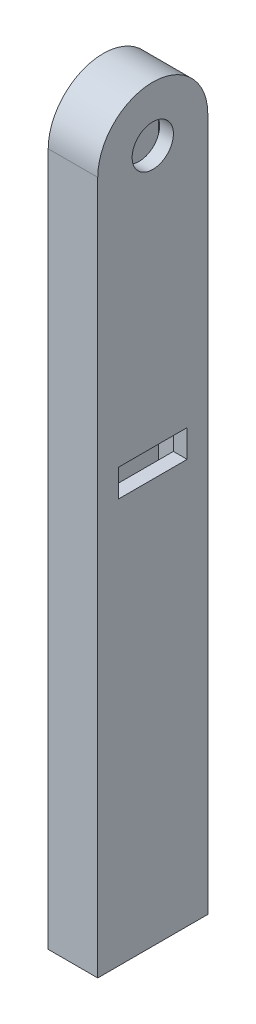
ISO-10303-21;
HEADER;
FILE_DESCRIPTION(('STEP AP214'),'2;1');
FILE_NAME('part.step','',(''),(''),'','','');
FILE_SCHEMA(('AUTOMOTIVE_DESIGN { 1 0 10303 214 1 1 1 1 }'));
ENDSEC;
DATA;
#1=APPLICATION_CONTEXT('core data for automotive mechanical design processes');
#2=APPLICATION_PROTOCOL_DEFINITION('international standard','automotive_design',2000,#1);
#3=PRODUCT_CONTEXT('',#1,'mechanical');
#4=PRODUCT('Part','Part','',(#3));
#5=PRODUCT_RELATED_PRODUCT_CATEGORY('part','',(#4));
#6=PRODUCT_DEFINITION_FORMATION('','',#4);
#7=PRODUCT_DEFINITION_CONTEXT('part definition',#1,'design');
#8=PRODUCT_DEFINITION('design','',#6,#7);
#9=PRODUCT_DEFINITION_SHAPE('','',#8);
#10=(LENGTH_UNIT() NAMED_UNIT(*) SI_UNIT(.MILLI.,.METRE.));
#11=(NAMED_UNIT(*) PLANE_ANGLE_UNIT() SI_UNIT($,.RADIAN.));
#12=(NAMED_UNIT(*) SI_UNIT($,.STERADIAN.) SOLID_ANGLE_UNIT());
#13=UNCERTAINTY_MEASURE_WITH_UNIT(LENGTH_MEASURE(1.E-05),#10,'distance_accuracy_value','');
#14=(GEOMETRIC_REPRESENTATION_CONTEXT(3) GLOBAL_UNCERTAINTY_ASSIGNED_CONTEXT((#13)) GLOBAL_UNIT_ASSIGNED_CONTEXT((#10,
#11,#12)) REPRESENTATION_CONTEXT('',''));
#15=CARTESIAN_POINT('',(0.,0.,0.));
#16=DIRECTION('',(0.,0.,1.));
#17=DIRECTION('',(1.,0.,0.));
#18=AXIS2_PLACEMENT_3D('',#15,#16,#17);
#19=CARTESIAN_POINT('',(-4.,0.,-20.));
#20=DIRECTION('',(0.,0.,-1.));
#21=DIRECTION('',(0.,1.,0.));
#22=AXIS2_PLACEMENT_3D('',#19,#20,#21);
#23=PLANE('',#22);
#24=DIRECTION('',(0.,-1.,0.));
#25=VECTOR('',#24,1.);
#26=CARTESIAN_POINT('',(-9.,0.,-20.));
#27=LINE('',#26,#25);
#28=CARTESIAN_POINT('',(-9.,0.,-20.));
#29=VERTEX_POINT('',#28);
#30=CARTESIAN_POINT('',(-9.,-252.,-20.));
#31=VERTEX_POINT('',#30);
#32=EDGE_CURVE('E196',#29,#31,#27,.T.);
#33=ORIENTED_EDGE('',*,*,#32,.F.);
#34=DIRECTION('',(-1.,0.,0.));
#35=VECTOR('',#34,1.);
#36=CARTESIAN_POINT('',(-4.,0.,-20.));
#37=LINE('',#36,#35);
#38=CARTESIAN_POINT('',(9.,0.,-20.));
#39=VERTEX_POINT('',#38);
#40=EDGE_CURVE('E11',#39,#29,#37,.T.);
#41=ORIENTED_EDGE('',*,*,#40,.F.);
#42=DIRECTION('',(0.,-1.,0.));
#43=VECTOR('',#42,1.);
#44=CARTESIAN_POINT('',(9.,0.,-20.));
#45=LINE('',#44,#43);
#46=CARTESIAN_POINT('',(9.,-252.,-20.));
#47=VERTEX_POINT('',#46);
#48=EDGE_CURVE('E168',#39,#47,#45,.T.);
#49=ORIENTED_EDGE('',*,*,#48,.T.);
#50=DIRECTION('',(-1.,0.,0.));
#51=VECTOR('',#50,1.);
#52=CARTESIAN_POINT('',(-4.,-252.,-20.));
#53=LINE('',#52,#51);
#54=EDGE_CURVE('E215',#47,#31,#53,.T.);
#55=ORIENTED_EDGE('',*,*,#54,.T.);
#56=EDGE_LOOP('',(#33,#41,#49,#55));
#57=FACE_BOUND('',#56,.T.);
#58=ADVANCED_FACE('F35',(#57),#23,.T.);
#59=CARTESIAN_POINT('',(-4.,0.,0.));
#60=DIRECTION('',(-1.,0.,0.));
#61=DIRECTION('',(0.,0.,1.));
#62=AXIS2_PLACEMENT_3D('',#59,#60,#61);
#63=CYLINDRICAL_SURFACE('',#62,20.);
#64=CARTESIAN_POINT('',(-9.,0.,0.));
#65=DIRECTION('',(1.,0.,0.));
#66=DIRECTION('',(0.,0.,-1.));
#67=AXIS2_PLACEMENT_3D('',#64,#65,#66);
#68=CIRCLE('',#67,20.);
#69=CARTESIAN_POINT('',(-9.,0.,20.));
#70=VERTEX_POINT('',#69);
#71=EDGE_CURVE('E219',#29,#70,#68,.T.);
#72=ORIENTED_EDGE('',*,*,#71,.T.);
#73=DIRECTION('',(-1.,0.,0.));
#74=VECTOR('',#73,1.);
#75=CARTESIAN_POINT('',(-4.,0.,20.));
#76=LINE('',#75,#74);
#77=CARTESIAN_POINT('',(9.,0.,20.));
#78=VERTEX_POINT('',#77);
#79=EDGE_CURVE('E42',#78,#70,#76,.T.);
#80=ORIENTED_EDGE('',*,*,#79,.F.);
#81=CARTESIAN_POINT('',(9.,0.,0.));
#82=DIRECTION('',(1.,0.,0.));
#83=DIRECTION('',(0.,0.,-1.));
#84=AXIS2_PLACEMENT_3D('',#81,#82,#83);
#85=CIRCLE('',#84,20.);
#86=EDGE_CURVE('E180',#39,#78,#85,.T.);
#87=ORIENTED_EDGE('',*,*,#86,.F.);
#88=ORIENTED_EDGE('',*,*,#40,.T.);
#89=EDGE_LOOP('',(#72,#80,#87,#88));
#90=FACE_BOUND('',#89,.T.);
#91=ADVANCED_FACE('F251',(#90),#63,.T.);
#92=CARTESIAN_POINT('',(-4.,0.,20.));
#93=DIRECTION('',(0.,0.,-1.));
#94=DIRECTION('',(0.,1.,0.));
#95=AXIS2_PLACEMENT_3D('',#92,#93,#94);
#96=PLANE('',#95);
#97=DIRECTION('',(0.,-1.,0.));
#98=VECTOR('',#97,1.);
#99=CARTESIAN_POINT('',(-9.,0.,20.));
#100=LINE('',#99,#98);
#101=CARTESIAN_POINT('',(-9.,-252.,20.));
#102=VERTEX_POINT('',#101);
#103=EDGE_CURVE('E221',#70,#102,#100,.T.);
#104=ORIENTED_EDGE('',*,*,#103,.T.);
#105=DIRECTION('',(-1.,0.,0.));
#106=VECTOR('',#105,1.);
#107=CARTESIAN_POINT('',(-4.,-252.,20.));
#108=LINE('',#107,#106);
#109=CARTESIAN_POINT('',(9.,-252.,20.));
#110=VERTEX_POINT('',#109);
#111=EDGE_CURVE('E229',#110,#102,#108,.T.);
#112=ORIENTED_EDGE('',*,*,#111,.F.);
#113=DIRECTION('',(0.,-1.,0.));
#114=VECTOR('',#113,1.);
#115=CARTESIAN_POINT('',(9.,0.,20.));
#116=LINE('',#115,#114);
#117=EDGE_CURVE('E183',#78,#110,#116,.T.);
#118=ORIENTED_EDGE('',*,*,#117,.F.);
#119=ORIENTED_EDGE('',*,*,#79,.T.);
#120=EDGE_LOOP('',(#104,#112,#118,#119));
#121=FACE_BOUND('',#120,.T.);
#122=ADVANCED_FACE('F235',(#121),#96,.F.);
#123=CARTESIAN_POINT('',(-4.,-252.,0.));
#124=DIRECTION('',(0.,1.,0.));
#125=DIRECTION('',(0.,0.,1.));
#126=AXIS2_PLACEMENT_3D('',#123,#124,#125);
#127=PLANE('',#126);
#128=DIRECTION('',(0.,0.,-1.));
#129=VECTOR('',#128,1.);
#130=CARTESIAN_POINT('',(-9.,-252.,0.));
#131=LINE('',#130,#129);
#132=EDGE_CURVE('E223',#102,#31,#131,.T.);
#133=ORIENTED_EDGE('',*,*,#132,.T.);
#134=ORIENTED_EDGE('',*,*,#54,.F.);
#135=DIRECTION('',(0.,0.,-1.));
#136=VECTOR('',#135,1.);
#137=CARTESIAN_POINT('',(9.,-252.,0.));
#138=LINE('',#137,#136);
#139=EDGE_CURVE('E186',#110,#47,#138,.T.);
#140=ORIENTED_EDGE('',*,*,#139,.F.);
#141=ORIENTED_EDGE('',*,*,#111,.T.);
#142=EDGE_LOOP('',(#133,#134,#140,#141));
#143=FACE_BOUND('',#142,.T.);
#144=ADVANCED_FACE('F245',(#143),#127,.F.);
#145=CARTESIAN_POINT('',(-4.,0.,0.));
#146=DIRECTION('',(-1.,0.,0.));
#147=DIRECTION('',(0.,0.,1.));
#148=AXIS2_PLACEMENT_3D('',#145,#146,#147);
#149=CYLINDRICAL_SURFACE('',#148,7.5);
#150=CARTESIAN_POINT('',(-4.,0.,0.));
#151=DIRECTION('',(1.,0.,0.));
#152=DIRECTION('',(0.,0.,-1.));
#153=AXIS2_PLACEMENT_3D('',#150,#151,#152);
#154=CIRCLE('',#153,7.5);
#155=CARTESIAN_POINT('',(-4.,0.,-7.5));
#156=VERTEX_POINT('',#155);
#157=EDGE_CURVE('E212',#156,#156,#154,.T.);
#158=ORIENTED_EDGE('',*,*,#157,.T.);
#159=EDGE_LOOP('',(#158));
#160=FACE_BOUND('',#159,.T.);
#161=CARTESIAN_POINT('',(-9.,0.,0.));
#162=DIRECTION('',(1.,0.,0.));
#163=DIRECTION('',(0.,0.,-1.));
#164=AXIS2_PLACEMENT_3D('',#161,#162,#163);
#165=CIRCLE('',#164,7.5);
#166=CARTESIAN_POINT('',(-9.,0.,-7.5));
#167=VERTEX_POINT('',#166);
#168=EDGE_CURVE('E216',#167,#167,#165,.T.);
#169=ORIENTED_EDGE('',*,*,#168,.F.);
#170=EDGE_LOOP('',(#169));
#171=FACE_BOUND('',#170,.T.);
#172=ADVANCED_FACE('F264',(#160,#171),#149,.F.);
#173=CARTESIAN_POINT('',(-4.,0.,0.));
#174=DIRECTION('',(1.,0.,0.));
#175=DIRECTION('',(0.,0.,-1.));
#176=AXIS2_PLACEMENT_3D('',#173,#174,#175);
#177=PLANE('',#176);
#178=CARTESIAN_POINT('',(-4.,0.,0.));
#179=DIRECTION('',(1.,0.,0.));
#180=DIRECTION('',(0.,0.,-1.));
#181=AXIS2_PLACEMENT_3D('',#178,#179,#180);
#182=CIRCLE('',#181,15.);
#183=CARTESIAN_POINT('',(-4.,0.,-15.));
#184=VERTEX_POINT('',#183);
#185=CARTESIAN_POINT('',(-4.,0.,15.));
#186=VERTEX_POINT('',#185);
#187=EDGE_CURVE('E194',#184,#186,#182,.T.);
#188=ORIENTED_EDGE('',*,*,#187,.T.);
#189=DIRECTION('',(0.,-1.,0.));
#190=VECTOR('',#189,1.);
#191=CARTESIAN_POINT('',(-4.,0.,15.));
#192=LINE('',#191,#190);
#193=CARTESIAN_POINT('',(-4.,-247.,15.));
#194=VERTEX_POINT('',#193);
#195=EDGE_CURVE('E191',#186,#194,#192,.T.);
#196=ORIENTED_EDGE('',*,*,#195,.T.);
#197=DIRECTION('',(0.,0.,-1.));
#198=VECTOR('',#197,1.);
#199=CARTESIAN_POINT('',(-4.,-247.,0.));
#200=LINE('',#199,#198);
#201=CARTESIAN_POINT('',(-4.,-247.,-15.));
#202=VERTEX_POINT('',#201);
#203=EDGE_CURVE('E193',#194,#202,#200,.T.);
#204=ORIENTED_EDGE('',*,*,#203,.T.);
#205=DIRECTION('',(0.,-1.,0.));
#206=VECTOR('',#205,1.);
#207=CARTESIAN_POINT('',(-4.,0.,-15.));
#208=LINE('',#207,#206);
#209=EDGE_CURVE('E197',#184,#202,#208,.T.);
#210=ORIENTED_EDGE('',*,*,#209,.F.);
#211=EDGE_LOOP('',(#188,#196,#204,#210));
#212=FACE_BOUND('',#211,.T.);
#213=ORIENTED_EDGE('',*,*,#157,.F.);
#214=EDGE_LOOP('',(#213));
#215=FACE_BOUND('',#214,.T.);
#216=ADVANCED_FACE('F267',(#212,#215),#177,.T.);
#217=CARTESIAN_POINT('',(-9.,0.,0.));
#218=DIRECTION('',(1.,0.,0.));
#219=DIRECTION('',(0.,0.,-1.));
#220=AXIS2_PLACEMENT_3D('',#217,#218,#219);
#221=PLANE('',#220);
#222=ORIENTED_EDGE('',*,*,#32,.T.);
#223=ORIENTED_EDGE('',*,*,#132,.F.);
#224=ORIENTED_EDGE('',*,*,#103,.F.);
#225=ORIENTED_EDGE('',*,*,#71,.F.);
#226=EDGE_LOOP('',(#222,#223,#224,#225));
#227=FACE_BOUND('',#226,.T.);
#228=ORIENTED_EDGE('',*,*,#168,.T.);
#229=EDGE_LOOP('',(#228));
#230=FACE_BOUND('',#229,.T.);
#231=ADVANCED_FACE('F241',(#227,#230),#221,.F.);
#232=CARTESIAN_POINT('',(274.925444439033,0.,0.));
#233=DIRECTION('',(-1.,0.,0.));
#234=DIRECTION('',(0.,0.,1.));
#235=AXIS2_PLACEMENT_3D('',#232,#233,#234);
#236=CYLINDRICAL_SURFACE('',#235,15.);
#237=DIRECTION('',(-1.,0.,0.));
#238=VECTOR('',#237,1.);
#239=CARTESIAN_POINT('',(274.925444439033,0.,-15.));
#240=LINE('',#239,#238);
#241=CARTESIAN_POINT('',(4.,0.,-15.));
#242=VERTEX_POINT('',#241);
#243=EDGE_CURVE('E201',#242,#184,#240,.T.);
#244=ORIENTED_EDGE('',*,*,#243,.F.);
#245=CARTESIAN_POINT('',(4.,0.,0.));
#246=DIRECTION('',(1.,0.,0.));
#247=DIRECTION('',(0.,0.,-1.));
#248=AXIS2_PLACEMENT_3D('',#245,#246,#247);
#249=CIRCLE('',#248,15.);
#250=CARTESIAN_POINT('',(4.,0.,15.));
#251=VERTEX_POINT('',#250);
#252=EDGE_CURVE('E165',#242,#251,#249,.T.);
#253=ORIENTED_EDGE('',*,*,#252,.T.);
#254=DIRECTION('',(-1.,0.,0.));
#255=VECTOR('',#254,1.);
#256=CARTESIAN_POINT('',(274.925444439033,0.,15.));
#257=LINE('',#256,#255);
#258=EDGE_CURVE('E176',#251,#186,#257,.T.);
#259=ORIENTED_EDGE('',*,*,#258,.T.);
#260=ORIENTED_EDGE('',*,*,#187,.F.);
#261=EDGE_LOOP('',(#244,#253,#259,#260));
#262=FACE_BOUND('',#261,.T.);
#263=ADVANCED_FACE('F271',(#262),#236,.F.);
#264=CARTESIAN_POINT('',(274.925444439033,0.,-15.));
#265=DIRECTION('',(0.,0.,-1.));
#266=DIRECTION('',(-1.,0.,0.));
#267=AXIS2_PLACEMENT_3D('',#264,#265,#266);
#268=PLANE('',#267);
#269=DIRECTION('',(-1.,0.,0.));
#270=VECTOR('',#269,1.);
#271=CARTESIAN_POINT('',(274.925444439033,-247.,-15.));
#272=LINE('',#271,#270);
#273=CARTESIAN_POINT('',(4.,-247.,-15.));
#274=VERTEX_POINT('',#273);
#275=EDGE_CURVE('E200',#274,#202,#272,.T.);
#276=ORIENTED_EDGE('',*,*,#275,.F.);
#277=DIRECTION('',(0.,-1.,0.));
#278=VECTOR('',#277,1.);
#279=CARTESIAN_POINT('',(4.,0.,-15.));
#280=LINE('',#279,#278);
#281=EDGE_CURVE('E160',#242,#274,#280,.T.);
#282=ORIENTED_EDGE('',*,*,#281,.F.);
#283=ORIENTED_EDGE('',*,*,#243,.T.);
#284=ORIENTED_EDGE('',*,*,#209,.T.);
#285=EDGE_LOOP('',(#276,#282,#283,#284));
#286=FACE_BOUND('',#285,.T.);
#287=ADVANCED_FACE('F277',(#286),#268,.F.);
#288=CARTESIAN_POINT('',(274.925444439033,-247.,0.));
#289=DIRECTION('',(0.,1.,0.));
#290=DIRECTION('',(0.,0.,1.));
#291=AXIS2_PLACEMENT_3D('',#288,#289,#290);
#292=PLANE('',#291);
#293=DIRECTION('',(-1.,0.,0.));
#294=VECTOR('',#293,1.);
#295=CARTESIAN_POINT('',(274.925444439033,-247.,15.));
#296=LINE('',#295,#294);
#297=CARTESIAN_POINT('',(4.,-247.,15.));
#298=VERTEX_POINT('',#297);
#299=EDGE_CURVE('E203',#298,#194,#296,.T.);
#300=ORIENTED_EDGE('',*,*,#299,.F.);
#301=DIRECTION('',(0.,0.,-1.));
#302=VECTOR('',#301,1.);
#303=CARTESIAN_POINT('',(4.,-247.,0.));
#304=LINE('',#303,#302);
#305=EDGE_CURVE('E164',#298,#274,#304,.T.);
#306=ORIENTED_EDGE('',*,*,#305,.T.);
#307=ORIENTED_EDGE('',*,*,#275,.T.);
#308=ORIENTED_EDGE('',*,*,#203,.F.);
#309=EDGE_LOOP('',(#300,#306,#307,#308));
#310=FACE_BOUND('',#309,.T.);
#311=ADVANCED_FACE('F281',(#310),#292,.T.);
#312=CARTESIAN_POINT('',(274.925444439033,0.,15.));
#313=DIRECTION('',(0.,0.,-1.));
#314=DIRECTION('',(-1.,0.,0.));
#315=AXIS2_PLACEMENT_3D('',#312,#313,#314);
#316=PLANE('',#315);
#317=ORIENTED_EDGE('',*,*,#258,.F.);
#318=DIRECTION('',(0.,-1.,0.));
#319=VECTOR('',#318,1.);
#320=CARTESIAN_POINT('',(4.,0.,15.));
#321=LINE('',#320,#319);
#322=EDGE_CURVE('E161',#251,#298,#321,.T.);
#323=ORIENTED_EDGE('',*,*,#322,.T.);
#324=ORIENTED_EDGE('',*,*,#299,.T.);
#325=ORIENTED_EDGE('',*,*,#195,.F.);
#326=EDGE_LOOP('',(#317,#323,#324,#325));
#327=FACE_BOUND('',#326,.T.);
#328=ADVANCED_FACE('F285',(#327),#316,.T.);
#329=CARTESIAN_POINT('',(4.,0.,0.));
#330=DIRECTION('',(1.,0.,0.));
#331=DIRECTION('',(0.,0.,1.));
#332=AXIS2_PLACEMENT_3D('',#329,#330,#331);
#333=CYLINDRICAL_SURFACE('',#332,7.5);
#334=CARTESIAN_POINT('',(4.,0.,0.));
#335=DIRECTION('',(1.,0.,0.));
#336=DIRECTION('',(0.,0.,-1.));
#337=AXIS2_PLACEMENT_3D('',#334,#335,#336);
#338=CIRCLE('',#337,7.5);
#339=CARTESIAN_POINT('',(4.,0.,-7.5));
#340=VERTEX_POINT('',#339);
#341=EDGE_CURVE('E173',#340,#340,#338,.T.);
#342=ORIENTED_EDGE('',*,*,#341,.F.);
#343=EDGE_LOOP('',(#342));
#344=FACE_BOUND('',#343,.T.);
#345=CARTESIAN_POINT('',(9.,0.,0.));
#346=DIRECTION('',(1.,0.,0.));
#347=DIRECTION('',(0.,0.,-1.));
#348=AXIS2_PLACEMENT_3D('',#345,#346,#347);
#349=CIRCLE('',#348,7.5);
#350=CARTESIAN_POINT('',(9.,0.,-7.5));
#351=VERTEX_POINT('',#350);
#352=EDGE_CURVE('E177',#351,#351,#349,.T.);
#353=ORIENTED_EDGE('',*,*,#352,.T.);
#354=EDGE_LOOP('',(#353));
#355=FACE_BOUND('',#354,.T.);
#356=ADVANCED_FACE('F289',(#344,#355),#333,.F.);
#357=CARTESIAN_POINT('',(4.,0.,0.));
#358=DIRECTION('',(-1.,0.,0.));
#359=DIRECTION('',(0.,0.,-1.));
#360=AXIS2_PLACEMENT_3D('',#357,#358,#359);
#361=PLANE('',#360);
#362=DIRECTION('',(0.,1.,0.));
#363=VECTOR('',#362,1.);
#364=CARTESIAN_POINT('',(4.,0.,-12.5));
#365=LINE('',#364,#363);
#366=CARTESIAN_POINT('',(4.,-105.,-12.5));
#367=VERTEX_POINT('',#366);
#368=CARTESIAN_POINT('',(4.,-95.,-12.5));
#369=VERTEX_POINT('',#368);
#370=EDGE_CURVE('E136',#367,#369,#365,.T.);
#371=ORIENTED_EDGE('',*,*,#370,.T.);
#372=DIRECTION('',(0.,0.,1.));
#373=VECTOR('',#372,1.);
#374=CARTESIAN_POINT('',(4.,-95.,0.));
#375=LINE('',#374,#373);
#376=CARTESIAN_POINT('',(4.,-95.,12.5));
#377=VERTEX_POINT('',#376);
#378=EDGE_CURVE('E123',#369,#377,#375,.T.);
#379=ORIENTED_EDGE('',*,*,#378,.T.);
#380=DIRECTION('',(0.,-1.,0.));
#381=VECTOR('',#380,1.);
#382=CARTESIAN_POINT('',(4.,0.,12.5));
#383=LINE('',#382,#381);
#384=CARTESIAN_POINT('',(4.,-105.,12.5));
#385=VERTEX_POINT('',#384);
#386=EDGE_CURVE('E155',#377,#385,#383,.T.);
#387=ORIENTED_EDGE('',*,*,#386,.T.);
#388=DIRECTION('',(0.,0.,-1.));
#389=VECTOR('',#388,1.);
#390=CARTESIAN_POINT('',(4.,-105.,0.));
#391=LINE('',#390,#389);
#392=EDGE_CURVE('E144',#385,#367,#391,.T.);
#393=ORIENTED_EDGE('',*,*,#392,.T.);
#394=EDGE_LOOP('',(#371,#379,#387,#393));
#395=FACE_BOUND('',#394,.T.);
#396=ORIENTED_EDGE('',*,*,#252,.F.);
#397=ORIENTED_EDGE('',*,*,#281,.T.);
#398=ORIENTED_EDGE('',*,*,#305,.F.);
#399=ORIENTED_EDGE('',*,*,#322,.F.);
#400=EDGE_LOOP('',(#396,#397,#398,#399));
#401=FACE_BOUND('',#400,.T.);
#402=ORIENTED_EDGE('',*,*,#341,.T.);
#403=EDGE_LOOP('',(#402));
#404=FACE_BOUND('',#403,.T.);
#405=ADVANCED_FACE('F142',(#395,#401,#404),#361,.T.);
#406=CARTESIAN_POINT('',(9.,0.,0.));
#407=DIRECTION('',(-1.,0.,0.));
#408=DIRECTION('',(0.,0.,-1.));
#409=AXIS2_PLACEMENT_3D('',#406,#407,#408);
#410=PLANE('',#409);
#411=DIRECTION('',(0.,0.,1.));
#412=VECTOR('',#411,1.);
#413=CARTESIAN_POINT('',(9.,-95.,0.));
#414=LINE('',#413,#412);
#415=CARTESIAN_POINT('',(9.,-95.,-12.5));
#416=VERTEX_POINT('',#415);
#417=CARTESIAN_POINT('',(9.,-95.,12.5));
#418=VERTEX_POINT('',#417);
#419=EDGE_CURVE('E146',#416,#418,#414,.T.);
#420=ORIENTED_EDGE('',*,*,#419,.F.);
#421=DIRECTION('',(0.,1.,0.));
#422=VECTOR('',#421,1.);
#423=CARTESIAN_POINT('',(9.,0.,-12.5));
#424=LINE('',#423,#422);
#425=CARTESIAN_POINT('',(9.,-105.,-12.5));
#426=VERTEX_POINT('',#425);
#427=EDGE_CURVE('E139',#426,#416,#424,.T.);
#428=ORIENTED_EDGE('',*,*,#427,.F.);
#429=DIRECTION('',(0.,0.,-1.));
#430=VECTOR('',#429,1.);
#431=CARTESIAN_POINT('',(9.,-105.,0.));
#432=LINE('',#431,#430);
#433=CARTESIAN_POINT('',(9.,-105.,12.5));
#434=VERTEX_POINT('',#433);
#435=EDGE_CURVE('E151',#434,#426,#432,.T.);
#436=ORIENTED_EDGE('',*,*,#435,.F.);
#437=DIRECTION('',(0.,-1.,0.));
#438=VECTOR('',#437,1.);
#439=CARTESIAN_POINT('',(9.,0.,12.5));
#440=LINE('',#439,#438);
#441=EDGE_CURVE('E57',#418,#434,#440,.T.);
#442=ORIENTED_EDGE('',*,*,#441,.F.);
#443=EDGE_LOOP('',(#420,#428,#436,#442));
#444=FACE_BOUND('',#443,.T.);
#445=ORIENTED_EDGE('',*,*,#48,.F.);
#446=ORIENTED_EDGE('',*,*,#86,.T.);
#447=ORIENTED_EDGE('',*,*,#117,.T.);
#448=ORIENTED_EDGE('',*,*,#139,.T.);
#449=EDGE_LOOP('',(#445,#446,#447,#448));
#450=FACE_BOUND('',#449,.T.);
#451=ORIENTED_EDGE('',*,*,#352,.F.);
#452=EDGE_LOOP('',(#451));
#453=FACE_BOUND('',#452,.T.);
#454=ADVANCED_FACE('F249',(#444,#450,#453),#410,.F.);
#455=CARTESIAN_POINT('',(-9.001,0.,-12.5));
#456=DIRECTION('',(0.,0.,-1.));
#457=DIRECTION('',(0.,1.,0.));
#458=AXIS2_PLACEMENT_3D('',#455,#456,#457);
#459=PLANE('',#458);
#460=DIRECTION('',(1.,0.,0.));
#461=VECTOR('',#460,1.);
#462=CARTESIAN_POINT('',(-9.001,-105.,-12.5));
#463=LINE('',#462,#461);
#464=EDGE_CURVE('E49',#367,#426,#463,.T.);
#465=ORIENTED_EDGE('',*,*,#464,.T.);
#466=ORIENTED_EDGE('',*,*,#427,.T.);
#467=DIRECTION('',(1.,0.,0.));
#468=VECTOR('',#467,1.);
#469=CARTESIAN_POINT('',(-9.001,-95.,-12.5));
#470=LINE('',#469,#468);
#471=EDGE_CURVE('E127',#369,#416,#470,.T.);
#472=ORIENTED_EDGE('',*,*,#471,.F.);
#473=ORIENTED_EDGE('',*,*,#370,.F.);
#474=EDGE_LOOP('',(#465,#466,#472,#473));
#475=FACE_BOUND('',#474,.T.);
#476=ADVANCED_FACE('F135',(#475),#459,.F.);
#477=CARTESIAN_POINT('',(-9.001,-95.,0.));
#478=DIRECTION('',(0.,1.,0.));
#479=DIRECTION('',(0.,0.,1.));
#480=AXIS2_PLACEMENT_3D('',#477,#478,#479);
#481=PLANE('',#480);
#482=ORIENTED_EDGE('',*,*,#471,.T.);
#483=ORIENTED_EDGE('',*,*,#419,.T.);
#484=DIRECTION('',(1.,0.,0.));
#485=VECTOR('',#484,1.);
#486=CARTESIAN_POINT('',(-9.001,-95.,12.5));
#487=LINE('',#486,#485);
#488=EDGE_CURVE('E129',#377,#418,#487,.T.);
#489=ORIENTED_EDGE('',*,*,#488,.F.);
#490=ORIENTED_EDGE('',*,*,#378,.F.);
#491=EDGE_LOOP('',(#482,#483,#489,#490));
#492=FACE_BOUND('',#491,.T.);
#493=ADVANCED_FACE('F125',(#492),#481,.F.);
#494=CARTESIAN_POINT('',(-9.001,0.,12.5));
#495=DIRECTION('',(0.,0.,1.));
#496=DIRECTION('',(1.,0.,0.));
#497=AXIS2_PLACEMENT_3D('',#494,#495,#496);
#498=PLANE('',#497);
#499=ORIENTED_EDGE('',*,*,#488,.T.);
#500=ORIENTED_EDGE('',*,*,#441,.T.);
#501=DIRECTION('',(1.,0.,0.));
#502=VECTOR('',#501,1.);
#503=CARTESIAN_POINT('',(-9.001,-105.,12.5));
#504=LINE('',#503,#502);
#505=EDGE_CURVE('E154',#385,#434,#504,.T.);
#506=ORIENTED_EDGE('',*,*,#505,.F.);
#507=ORIENTED_EDGE('',*,*,#386,.F.);
#508=EDGE_LOOP('',(#499,#500,#506,#507));
#509=FACE_BOUND('',#508,.T.);
#510=ADVANCED_FACE('F303',(#509),#498,.F.);
#511=CARTESIAN_POINT('',(-9.001,-105.,0.));
#512=DIRECTION('',(0.,-1.,0.));
#513=DIRECTION('',(0.,0.,-1.));
#514=AXIS2_PLACEMENT_3D('',#511,#512,#513);
#515=PLANE('',#514);
#516=ORIENTED_EDGE('',*,*,#505,.T.);
#517=ORIENTED_EDGE('',*,*,#435,.T.);
#518=ORIENTED_EDGE('',*,*,#464,.F.);
#519=ORIENTED_EDGE('',*,*,#392,.F.);
#520=EDGE_LOOP('',(#516,#517,#518,#519));
#521=FACE_BOUND('',#520,.T.);
#522=ADVANCED_FACE('F306',(#521),#515,.F.);
#523=CLOSED_SHELL('',(#58,#91,#122,#144,#172,#216,#231,#263,#287,#311,#328,#356,#405,#454,#476,
#493,#510,#522));
#524=MANIFOLD_SOLID_BREP('B2',#523);
#525=ADVANCED_BREP_SHAPE_REPRESENTATION('',(#18,#524),#14);
#526=SHAPE_DEFINITION_REPRESENTATION(#9,#525);
ENDSEC;
END-ISO-10303-21;
